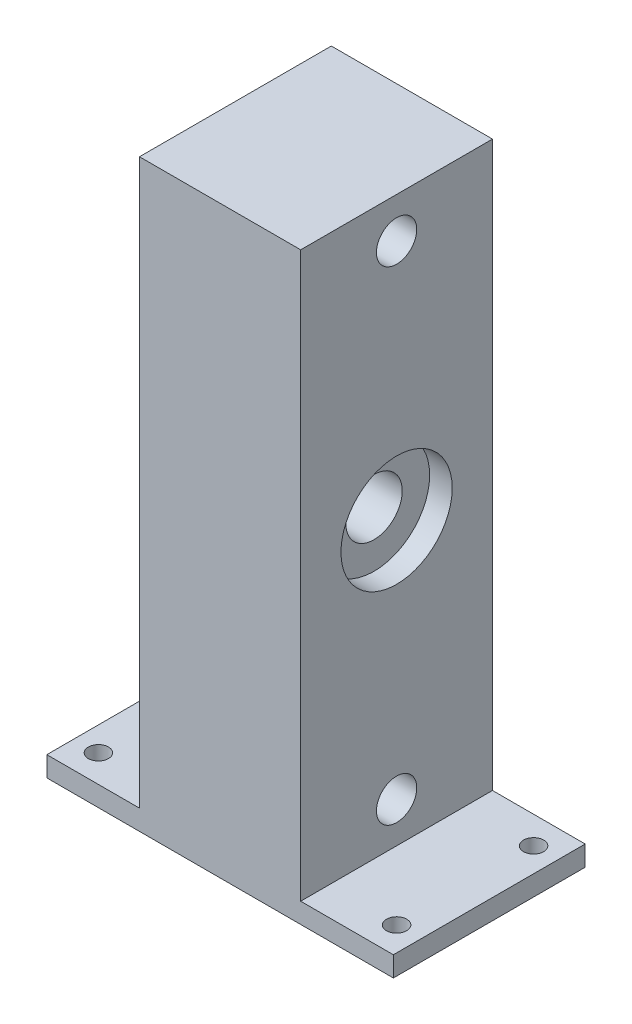
ISO-10303-21;
HEADER;
FILE_DESCRIPTION(('STEP AP214'),'2;1');
FILE_NAME('part.step','',(''),(''),'','','');
FILE_SCHEMA(('AUTOMOTIVE_DESIGN { 1 0 10303 214 1 1 1 1 }'));
ENDSEC;
DATA;
#1=APPLICATION_CONTEXT('core data for automotive mechanical design processes');
#2=APPLICATION_PROTOCOL_DEFINITION('international standard','automotive_design',2000,#1);
#3=PRODUCT_CONTEXT('',#1,'mechanical');
#4=PRODUCT('Part','Part','',(#3));
#5=PRODUCT_RELATED_PRODUCT_CATEGORY('part','',(#4));
#6=PRODUCT_DEFINITION_FORMATION('','',#4);
#7=PRODUCT_DEFINITION_CONTEXT('part definition',#1,'design');
#8=PRODUCT_DEFINITION('design','',#6,#7);
#9=PRODUCT_DEFINITION_SHAPE('','',#8);
#10=(LENGTH_UNIT() NAMED_UNIT(*) SI_UNIT(.MILLI.,.METRE.));
#11=(NAMED_UNIT(*) PLANE_ANGLE_UNIT() SI_UNIT($,.RADIAN.));
#12=(NAMED_UNIT(*) SI_UNIT($,.STERADIAN.) SOLID_ANGLE_UNIT());
#13=UNCERTAINTY_MEASURE_WITH_UNIT(LENGTH_MEASURE(1.E-05),#10,'distance_accuracy_value','');
#14=(GEOMETRIC_REPRESENTATION_CONTEXT(3) GLOBAL_UNCERTAINTY_ASSIGNED_CONTEXT((#13)) GLOBAL_UNIT_ASSIGNED_CONTEXT((#10,
#11,#12)) REPRESENTATION_CONTEXT('',''));
#15=CARTESIAN_POINT('',(0.,0.,0.));
#16=DIRECTION('',(0.,0.,1.));
#17=DIRECTION('',(1.,0.,0.));
#18=AXIS2_PLACEMENT_3D('',#15,#16,#17);
#19=CARTESIAN_POINT('',(-12.7,44.45,30.226));
#20=DIRECTION('',(1.,0.,0.));
#21=DIRECTION('',(0.,0.,-1.));
#22=AXIS2_PLACEMENT_3D('',#19,#20,#21);
#23=PLANE('',#22);
#24=DIRECTION('',(0.,-1.,0.));
#25=VECTOR('',#24,1.);
#26=CARTESIAN_POINT('',(-12.7,44.45,0.));
#27=LINE('',#26,#25);
#28=CARTESIAN_POINT('',(-12.7,44.45,0.));
#29=VERTEX_POINT('',#28);
#30=CARTESIAN_POINT('',(-12.7,-44.45,0.));
#31=VERTEX_POINT('',#30);
#32=EDGE_CURVE('E161',#29,#31,#27,.T.);
#33=ORIENTED_EDGE('',*,*,#32,.T.);
#34=DIRECTION('',(0.,0.,-1.));
#35=VECTOR('',#34,1.);
#36=CARTESIAN_POINT('',(-12.7,-44.45,30.226));
#37=LINE('',#36,#35);
#38=CARTESIAN_POINT('',(-12.7,-44.45,30.226));
#39=VERTEX_POINT('',#38);
#40=EDGE_CURVE('E11',#39,#31,#37,.T.);
#41=ORIENTED_EDGE('',*,*,#40,.F.);
#42=DIRECTION('',(0.,-1.,0.));
#43=VECTOR('',#42,1.);
#44=CARTESIAN_POINT('',(-12.7,44.45,30.226));
#45=LINE('',#44,#43);
#46=CARTESIAN_POINT('',(-12.7,44.45,30.226));
#47=VERTEX_POINT('',#46);
#48=EDGE_CURVE('E81',#47,#39,#45,.T.);
#49=ORIENTED_EDGE('',*,*,#48,.F.);
#50=DIRECTION('',(0.,0.,-1.));
#51=VECTOR('',#50,1.);
#52=CARTESIAN_POINT('',(-12.7,44.45,30.226));
#53=LINE('',#52,#51);
#54=EDGE_CURVE('E180',#47,#29,#53,.T.);
#55=ORIENTED_EDGE('',*,*,#54,.T.);
#56=EDGE_LOOP('',(#33,#41,#49,#55));
#57=FACE_BOUND('',#56,.T.);
#58=ADVANCED_FACE('F38',(#57),#23,.F.);
#59=CARTESIAN_POINT('',(12.7,44.45,30.226));
#60=DIRECTION('',(-1.,0.,0.));
#61=DIRECTION('',(0.,0.,1.));
#62=AXIS2_PLACEMENT_3D('',#59,#60,#61);
#63=PLANE('',#62);
#64=CARTESIAN_POINT('',(12.7,0.,15.113));
#65=DIRECTION('',(1.,0.,0.));
#66=DIRECTION('',(0.,0.,-1.));
#67=AXIS2_PLACEMENT_3D('',#64,#65,#66);
#68=CIRCLE('',#67,8.763);
#69=CARTESIAN_POINT('',(12.7,0.,6.35));
#70=VERTEX_POINT('',#69);
#71=EDGE_CURVE('E147',#70,#70,#68,.T.);
#72=ORIENTED_EDGE('',*,*,#71,.F.);
#73=EDGE_LOOP('',(#72));
#74=FACE_BOUND('',#73,.T.);
#75=CARTESIAN_POINT('',(12.7,38.1,15.113));
#76=DIRECTION('',(1.,0.,0.));
#77=DIRECTION('',(0.,0.,-1.));
#78=AXIS2_PLACEMENT_3D('',#75,#76,#77);
#79=CIRCLE('',#78,3.175);
#80=CARTESIAN_POINT('',(12.7,38.1,11.938));
#81=VERTEX_POINT('',#80);
#82=EDGE_CURVE('E162',#81,#81,#79,.T.);
#83=ORIENTED_EDGE('',*,*,#82,.F.);
#84=EDGE_LOOP('',(#83));
#85=FACE_BOUND('',#84,.T.);
#86=CARTESIAN_POINT('',(12.7,-38.1,15.113));
#87=DIRECTION('',(1.,0.,0.));
#88=DIRECTION('',(0.,0.,-1.));
#89=AXIS2_PLACEMENT_3D('',#86,#87,#88);
#90=CIRCLE('',#89,3.175);
#91=CARTESIAN_POINT('',(12.7,-38.1,11.938));
#92=VERTEX_POINT('',#91);
#93=EDGE_CURVE('E156',#92,#92,#90,.T.);
#94=ORIENTED_EDGE('',*,*,#93,.F.);
#95=EDGE_LOOP('',(#94));
#96=FACE_BOUND('',#95,.T.);
#97=DIRECTION('',(0.,1.,0.));
#98=VECTOR('',#97,1.);
#99=CARTESIAN_POINT('',(12.7,44.45,0.));
#100=LINE('',#99,#98);
#101=CARTESIAN_POINT('',(12.7,-44.45,0.));
#102=VERTEX_POINT('',#101);
#103=CARTESIAN_POINT('',(12.7,44.45,0.));
#104=VERTEX_POINT('',#103);
#105=EDGE_CURVE('E70',#102,#104,#100,.T.);
#106=ORIENTED_EDGE('',*,*,#105,.T.);
#107=DIRECTION('',(0.,0.,-1.));
#108=VECTOR('',#107,1.);
#109=CARTESIAN_POINT('',(12.7,44.45,30.226));
#110=LINE('',#109,#108);
#111=CARTESIAN_POINT('',(12.7,44.45,30.226));
#112=VERTEX_POINT('',#111);
#113=EDGE_CURVE('E189',#112,#104,#110,.T.);
#114=ORIENTED_EDGE('',*,*,#113,.F.);
#115=DIRECTION('',(0.,1.,0.));
#116=VECTOR('',#115,1.);
#117=CARTESIAN_POINT('',(12.7,44.45,30.226));
#118=LINE('',#117,#116);
#119=CARTESIAN_POINT('',(12.7,-44.45,30.226));
#120=VERTEX_POINT('',#119);
#121=EDGE_CURVE('E175',#120,#112,#118,.T.);
#122=ORIENTED_EDGE('',*,*,#121,.F.);
#123=DIRECTION('',(0.,0.,-1.));
#124=VECTOR('',#123,1.);
#125=CARTESIAN_POINT('',(12.7,-44.45,30.226));
#126=LINE('',#125,#124);
#127=EDGE_CURVE('E48',#120,#102,#126,.T.);
#128=ORIENTED_EDGE('',*,*,#127,.T.);
#129=EDGE_LOOP('',(#106,#114,#122,#128));
#130=FACE_BOUND('',#129,.T.);
#131=ADVANCED_FACE('F194',(#74,#85,#96,#130),#63,.F.);
#132=CARTESIAN_POINT('',(-12.7,44.45,30.226));
#133=DIRECTION('',(0.,-1.,0.));
#134=DIRECTION('',(0.,0.,-1.));
#135=AXIS2_PLACEMENT_3D('',#132,#133,#134);
#136=PLANE('',#135);
#137=DIRECTION('',(-1.,0.,0.));
#138=VECTOR('',#137,1.);
#139=CARTESIAN_POINT('',(-12.7,44.45,0.));
#140=LINE('',#139,#138);
#141=EDGE_CURVE('E76',#104,#29,#140,.T.);
#142=ORIENTED_EDGE('',*,*,#141,.T.);
#143=ORIENTED_EDGE('',*,*,#54,.F.);
#144=DIRECTION('',(-1.,0.,0.));
#145=VECTOR('',#144,1.);
#146=CARTESIAN_POINT('',(-12.7,44.45,30.226));
#147=LINE('',#146,#145);
#148=EDGE_CURVE('E56',#112,#47,#147,.T.);
#149=ORIENTED_EDGE('',*,*,#148,.F.);
#150=ORIENTED_EDGE('',*,*,#113,.T.);
#151=EDGE_LOOP('',(#142,#143,#149,#150));
#152=FACE_BOUND('',#151,.T.);
#153=ADVANCED_FACE('F290',(#152),#136,.F.);
#154=CARTESIAN_POINT('',(0.,0.,30.226));
#155=DIRECTION('',(0.,0.,1.));
#156=DIRECTION('',(1.,0.,0.));
#157=AXIS2_PLACEMENT_3D('',#154,#155,#156);
#158=PLANE('',#157);
#159=ORIENTED_EDGE('',*,*,#48,.T.);
#160=DIRECTION('',(-1.,0.,0.));
#161=VECTOR('',#160,1.);
#162=CARTESIAN_POINT('',(-27.305,-44.45,30.226));
#163=LINE('',#162,#161);
#164=CARTESIAN_POINT('',(-27.305,-44.45,30.226));
#165=VERTEX_POINT('',#164);
#166=EDGE_CURVE('E214',#39,#165,#163,.T.);
#167=ORIENTED_EDGE('',*,*,#166,.T.);
#168=DIRECTION('',(0.,1.,0.));
#169=VECTOR('',#168,1.);
#170=CARTESIAN_POINT('',(-27.305,-47.625,30.226));
#171=LINE('',#170,#169);
#172=CARTESIAN_POINT('',(-27.305,-47.625,30.226));
#173=VERTEX_POINT('',#172);
#174=EDGE_CURVE('E217',#173,#165,#171,.T.);
#175=ORIENTED_EDGE('',*,*,#174,.F.);
#176=DIRECTION('',(-1.,0.,0.));
#177=VECTOR('',#176,1.);
#178=CARTESIAN_POINT('',(-27.305,-47.625,30.226));
#179=LINE('',#178,#177);
#180=CARTESIAN_POINT('',(27.305,-47.625,30.226));
#181=VERTEX_POINT('',#180);
#182=EDGE_CURVE('E131',#181,#173,#179,.T.);
#183=ORIENTED_EDGE('',*,*,#182,.F.);
#184=DIRECTION('',(0.,1.,0.));
#185=VECTOR('',#184,1.);
#186=CARTESIAN_POINT('',(27.305,-47.625,30.226));
#187=LINE('',#186,#185);
#188=CARTESIAN_POINT('',(27.305,-44.45,30.226));
#189=VERTEX_POINT('',#188);
#190=EDGE_CURVE('E149',#181,#189,#187,.T.);
#191=ORIENTED_EDGE('',*,*,#190,.T.);
#192=EDGE_CURVE('E136',#189,#120,#163,.T.);
#193=ORIENTED_EDGE('',*,*,#192,.T.);
#194=ORIENTED_EDGE('',*,*,#121,.T.);
#195=ORIENTED_EDGE('',*,*,#148,.T.);
#196=EDGE_LOOP('',(#159,#167,#175,#183,#191,#193,#194,#195));
#197=FACE_BOUND('',#196,.T.);
#198=ADVANCED_FACE('F222',(#197),#158,.T.);
#199=CARTESIAN_POINT('',(0.,0.,0.));
#200=DIRECTION('',(0.,0.,1.));
#201=DIRECTION('',(1.,0.,0.));
#202=AXIS2_PLACEMENT_3D('',#199,#200,#201);
#203=PLANE('',#202);
#204=ORIENTED_EDGE('',*,*,#32,.F.);
#205=ORIENTED_EDGE('',*,*,#141,.F.);
#206=ORIENTED_EDGE('',*,*,#105,.F.);
#207=DIRECTION('',(1.,0.,0.));
#208=VECTOR('',#207,1.);
#209=CARTESIAN_POINT('',(-27.305,-44.45,0.));
#210=LINE('',#209,#208);
#211=CARTESIAN_POINT('',(27.305,-44.45,0.));
#212=VERTEX_POINT('',#211);
#213=EDGE_CURVE('E199',#102,#212,#210,.T.);
#214=ORIENTED_EDGE('',*,*,#213,.T.);
#215=DIRECTION('',(0.,1.,0.));
#216=VECTOR('',#215,1.);
#217=CARTESIAN_POINT('',(27.305,-47.625,0.));
#218=LINE('',#217,#216);
#219=CARTESIAN_POINT('',(27.305,-47.625,0.));
#220=VERTEX_POINT('',#219);
#221=EDGE_CURVE('E121',#220,#212,#218,.T.);
#222=ORIENTED_EDGE('',*,*,#221,.F.);
#223=DIRECTION('',(1.,0.,0.));
#224=VECTOR('',#223,1.);
#225=CARTESIAN_POINT('',(-27.305,-47.625,0.));
#226=LINE('',#225,#224);
#227=CARTESIAN_POINT('',(-27.305,-47.625,0.));
#228=VERTEX_POINT('',#227);
#229=EDGE_CURVE('E112',#228,#220,#226,.T.);
#230=ORIENTED_EDGE('',*,*,#229,.F.);
#231=DIRECTION('',(0.,1.,0.));
#232=VECTOR('',#231,1.);
#233=CARTESIAN_POINT('',(-27.305,-47.625,0.));
#234=LINE('',#233,#232);
#235=CARTESIAN_POINT('',(-27.305,-44.45,0.));
#236=VERTEX_POINT('',#235);
#237=EDGE_CURVE('E118',#228,#236,#234,.T.);
#238=ORIENTED_EDGE('',*,*,#237,.T.);
#239=EDGE_CURVE('E204',#236,#31,#210,.T.);
#240=ORIENTED_EDGE('',*,*,#239,.T.);
#241=EDGE_LOOP('',(#204,#205,#206,#214,#222,#230,#238,#240));
#242=FACE_BOUND('',#241,.T.);
#243=ADVANCED_FACE('F115',(#242),#203,.F.);
#244=CARTESIAN_POINT('',(0.,-38.1,15.113));
#245=DIRECTION('',(1.,0.,0.));
#246=DIRECTION('',(0.,0.,-1.));
#247=AXIS2_PLACEMENT_3D('',#244,#245,#246);
#248=CYLINDRICAL_SURFACE('',#247,3.175);
#249=CARTESIAN_POINT('',(0.,-38.1,15.113));
#250=DIRECTION('',(1.,0.,0.));
#251=DIRECTION('',(0.,0.,-1.));
#252=AXIS2_PLACEMENT_3D('',#249,#250,#251);
#253=CIRCLE('',#252,3.175);
#254=CARTESIAN_POINT('',(0.,-38.1,11.938));
#255=VERTEX_POINT('',#254);
#256=EDGE_CURVE('E166',#255,#255,#253,.T.);
#257=ORIENTED_EDGE('',*,*,#256,.F.);
#258=EDGE_LOOP('',(#257));
#259=FACE_BOUND('',#258,.T.);
#260=ORIENTED_EDGE('',*,*,#93,.T.);
#261=EDGE_LOOP('',(#260));
#262=FACE_BOUND('',#261,.T.);
#263=ADVANCED_FACE('F390',(#259,#262),#248,.F.);
#264=CARTESIAN_POINT('',(0.,-38.1,15.113));
#265=DIRECTION('',(1.,0.,0.));
#266=DIRECTION('',(0.,0.,-1.));
#267=AXIS2_PLACEMENT_3D('',#264,#265,#266);
#268=PLANE('',#267);
#269=ORIENTED_EDGE('',*,*,#256,.T.);
#270=EDGE_LOOP('',(#269));
#271=FACE_BOUND('',#270,.T.);
#272=ADVANCED_FACE('F435',(#271),#268,.T.);
#273=CARTESIAN_POINT('',(0.,38.1,15.113));
#274=DIRECTION('',(1.,0.,0.));
#275=DIRECTION('',(0.,0.,-1.));
#276=AXIS2_PLACEMENT_3D('',#273,#274,#275);
#277=CYLINDRICAL_SURFACE('',#276,3.175);
#278=CARTESIAN_POINT('',(0.,38.1,15.113));
#279=DIRECTION('',(1.,0.,0.));
#280=DIRECTION('',(0.,0.,-1.));
#281=AXIS2_PLACEMENT_3D('',#278,#279,#280);
#282=CIRCLE('',#281,3.175);
#283=CARTESIAN_POINT('',(0.,38.1,11.938));
#284=VERTEX_POINT('',#283);
#285=EDGE_CURVE('E157',#284,#284,#282,.T.);
#286=ORIENTED_EDGE('',*,*,#285,.F.);
#287=EDGE_LOOP('',(#286));
#288=FACE_BOUND('',#287,.T.);
#289=ORIENTED_EDGE('',*,*,#82,.T.);
#290=EDGE_LOOP('',(#289));
#291=FACE_BOUND('',#290,.T.);
#292=ADVANCED_FACE('F425',(#288,#291),#277,.F.);
#293=CARTESIAN_POINT('',(0.,38.1,15.113));
#294=DIRECTION('',(1.,0.,0.));
#295=DIRECTION('',(0.,0.,-1.));
#296=AXIS2_PLACEMENT_3D('',#293,#294,#295);
#297=PLANE('',#296);
#298=ORIENTED_EDGE('',*,*,#285,.T.);
#299=EDGE_LOOP('',(#298));
#300=FACE_BOUND('',#299,.T.);
#301=ADVANCED_FACE('F305',(#300),#297,.T.);
#302=CARTESIAN_POINT('',(9.14400000000001,0.,15.113));
#303=DIRECTION('',(1.,0.,0.));
#304=DIRECTION('',(0.,0.,-1.));
#305=AXIS2_PLACEMENT_3D('',#302,#303,#304);
#306=CYLINDRICAL_SURFACE('',#305,8.763);
#307=CARTESIAN_POINT('',(9.14400000000001,0.,15.113));
#308=DIRECTION('',(1.,0.,0.));
#309=DIRECTION('',(0.,0.,-1.));
#310=AXIS2_PLACEMENT_3D('',#307,#308,#309);
#311=CIRCLE('',#310,8.763);
#312=CARTESIAN_POINT('',(9.14400000000001,0.,6.35));
#313=VERTEX_POINT('',#312);
#314=EDGE_CURVE('E142',#313,#313,#311,.T.);
#315=ORIENTED_EDGE('',*,*,#314,.F.);
#316=EDGE_LOOP('',(#315));
#317=FACE_BOUND('',#316,.T.);
#318=ORIENTED_EDGE('',*,*,#71,.T.);
#319=EDGE_LOOP('',(#318));
#320=FACE_BOUND('',#319,.T.);
#321=ADVANCED_FACE('F297',(#317,#320),#306,.F.);
#322=CARTESIAN_POINT('',(0.,-44.45,0.));
#323=DIRECTION('',(0.,-1.,0.));
#324=DIRECTION('',(0.,0.,-1.));
#325=AXIS2_PLACEMENT_3D('',#322,#323,#324);
#326=PLANE('',#325);
#327=CARTESIAN_POINT('',(-23.495,-44.45,4.31799999999999));
#328=DIRECTION('',(0.,-1.,0.));
#329=DIRECTION('',(0.,0.,-1.));
#330=AXIS2_PLACEMENT_3D('',#327,#328,#329);
#331=CIRCLE('',#330,1.5875);
#332=CARTESIAN_POINT('',(-23.495,-44.45,2.73049999999999));
#333=VERTEX_POINT('',#332);
#334=EDGE_CURVE('E233',#333,#333,#331,.T.);
#335=ORIENTED_EDGE('',*,*,#334,.T.);
#336=EDGE_LOOP('',(#335));
#337=FACE_BOUND('',#336,.T.);
#338=CARTESIAN_POINT('',(-23.495,-44.45,25.908));
#339=DIRECTION('',(0.,-1.,0.));
#340=DIRECTION('',(0.,0.,-1.));
#341=AXIS2_PLACEMENT_3D('',#338,#339,#340);
#342=CIRCLE('',#341,1.5875);
#343=CARTESIAN_POINT('',(-23.495,-44.45,24.3205));
#344=VERTEX_POINT('',#343);
#345=EDGE_CURVE('E208',#344,#344,#342,.T.);
#346=ORIENTED_EDGE('',*,*,#345,.T.);
#347=EDGE_LOOP('',(#346));
#348=FACE_BOUND('',#347,.T.);
#349=ORIENTED_EDGE('',*,*,#166,.F.);
#350=ORIENTED_EDGE('',*,*,#40,.T.);
#351=ORIENTED_EDGE('',*,*,#239,.F.);
#352=DIRECTION('',(0.,0.,-1.));
#353=VECTOR('',#352,1.);
#354=CARTESIAN_POINT('',(-27.305,-44.45,30.226));
#355=LINE('',#354,#353);
#356=EDGE_CURVE('E140',#165,#236,#355,.T.);
#357=ORIENTED_EDGE('',*,*,#356,.F.);
#358=EDGE_LOOP('',(#349,#350,#351,#357));
#359=FACE_BOUND('',#358,.T.);
#360=ADVANCED_FACE('F294',(#337,#348,#359),#326,.F.);
#361=CARTESIAN_POINT('',(-27.305,-47.625,30.226));
#362=DIRECTION('',(1.,0.,0.));
#363=DIRECTION('',(0.,0.,-1.));
#364=AXIS2_PLACEMENT_3D('',#361,#362,#363);
#365=PLANE('',#364);
#366=ORIENTED_EDGE('',*,*,#356,.T.);
#367=ORIENTED_EDGE('',*,*,#237,.F.);
#368=DIRECTION('',(0.,0.,-1.));
#369=VECTOR('',#368,1.);
#370=CARTESIAN_POINT('',(-27.305,-47.625,30.226));
#371=LINE('',#370,#369);
#372=EDGE_CURVE('E126',#173,#228,#371,.T.);
#373=ORIENTED_EDGE('',*,*,#372,.F.);
#374=ORIENTED_EDGE('',*,*,#174,.T.);
#375=EDGE_LOOP('',(#366,#367,#373,#374));
#376=FACE_BOUND('',#375,.T.);
#377=ADVANCED_FACE('F138',(#376),#365,.F.);
#378=CARTESIAN_POINT('',(27.305,-47.625,30.226));
#379=DIRECTION('',(-1.,0.,0.));
#380=DIRECTION('',(0.,0.,1.));
#381=AXIS2_PLACEMENT_3D('',#378,#379,#380);
#382=PLANE('',#381);
#383=DIRECTION('',(0.,0.,1.));
#384=VECTOR('',#383,1.);
#385=CARTESIAN_POINT('',(27.305,-44.45,30.226));
#386=LINE('',#385,#384);
#387=EDGE_CURVE('E202',#212,#189,#386,.T.);
#388=ORIENTED_EDGE('',*,*,#387,.T.);
#389=ORIENTED_EDGE('',*,*,#190,.F.);
#390=DIRECTION('',(0.,0.,1.));
#391=VECTOR('',#390,1.);
#392=CARTESIAN_POINT('',(27.305,-47.625,30.226));
#393=LINE('',#392,#391);
#394=EDGE_CURVE('E125',#220,#181,#393,.T.);
#395=ORIENTED_EDGE('',*,*,#394,.F.);
#396=ORIENTED_EDGE('',*,*,#221,.T.);
#397=EDGE_LOOP('',(#388,#389,#395,#396));
#398=FACE_BOUND('',#397,.T.);
#399=ADVANCED_FACE('F224',(#398),#382,.F.);
#400=CARTESIAN_POINT('',(0.,-47.625,0.));
#401=DIRECTION('',(0.,-1.,0.));
#402=DIRECTION('',(0.,0.,-1.));
#403=AXIS2_PLACEMENT_3D('',#400,#401,#402);
#404=PLANE('',#403);
#405=CARTESIAN_POINT('',(23.495,-47.625,25.908));
#406=DIRECTION('',(0.,-1.,0.));
#407=DIRECTION('',(0.,0.,-1.));
#408=AXIS2_PLACEMENT_3D('',#405,#406,#407);
#409=CIRCLE('',#408,1.5875);
#410=CARTESIAN_POINT('',(23.495,-47.625,24.3205));
#411=VERTEX_POINT('',#410);
#412=EDGE_CURVE('E237',#411,#411,#409,.T.);
#413=ORIENTED_EDGE('',*,*,#412,.F.);
#414=EDGE_LOOP('',(#413));
#415=FACE_BOUND('',#414,.T.);
#416=CARTESIAN_POINT('',(23.495,-47.625,4.31799999999999));
#417=DIRECTION('',(0.,-1.,0.));
#418=DIRECTION('',(0.,0.,-1.));
#419=AXIS2_PLACEMENT_3D('',#416,#417,#418);
#420=CIRCLE('',#419,1.5875);
#421=CARTESIAN_POINT('',(23.495,-47.625,2.73049999999999));
#422=VERTEX_POINT('',#421);
#423=EDGE_CURVE('E245',#422,#422,#420,.T.);
#424=ORIENTED_EDGE('',*,*,#423,.F.);
#425=EDGE_LOOP('',(#424));
#426=FACE_BOUND('',#425,.T.);
#427=CARTESIAN_POINT('',(-23.495,-47.625,4.31799999999999));
#428=DIRECTION('',(0.,-1.,0.));
#429=DIRECTION('',(0.,0.,-1.));
#430=AXIS2_PLACEMENT_3D('',#427,#428,#429);
#431=CIRCLE('',#430,1.5875);
#432=CARTESIAN_POINT('',(-23.495,-47.625,2.73049999999999));
#433=VERTEX_POINT('',#432);
#434=EDGE_CURVE('E253',#433,#433,#431,.T.);
#435=ORIENTED_EDGE('',*,*,#434,.F.);
#436=EDGE_LOOP('',(#435));
#437=FACE_BOUND('',#436,.T.);
#438=CARTESIAN_POINT('',(-23.495,-47.625,25.908));
#439=DIRECTION('',(0.,-1.,0.));
#440=DIRECTION('',(0.,0.,-1.));
#441=AXIS2_PLACEMENT_3D('',#438,#439,#440);
#442=CIRCLE('',#441,1.5875);
#443=CARTESIAN_POINT('',(-23.495,-47.625,24.3205));
#444=VERTEX_POINT('',#443);
#445=EDGE_CURVE('E229',#444,#444,#442,.T.);
#446=ORIENTED_EDGE('',*,*,#445,.F.);
#447=EDGE_LOOP('',(#446));
#448=FACE_BOUND('',#447,.T.);
#449=ORIENTED_EDGE('',*,*,#372,.T.);
#450=ORIENTED_EDGE('',*,*,#229,.T.);
#451=ORIENTED_EDGE('',*,*,#394,.T.);
#452=ORIENTED_EDGE('',*,*,#182,.T.);
#453=EDGE_LOOP('',(#449,#450,#451,#452));
#454=FACE_BOUND('',#453,.T.);
#455=ADVANCED_FACE('F129',(#415,#426,#437,#448,#454),#404,.T.);
#456=CARTESIAN_POINT('',(23.495,-44.45,25.908));
#457=DIRECTION('',(0.,-1.,0.));
#458=DIRECTION('',(0.,0.,-1.));
#459=AXIS2_PLACEMENT_3D('',#456,#457,#458);
#460=CIRCLE('',#459,1.5875);
#461=CARTESIAN_POINT('',(23.495,-44.45,24.3205));
#462=VERTEX_POINT('',#461);
#463=EDGE_CURVE('E241',#462,#462,#460,.T.);
#464=ORIENTED_EDGE('',*,*,#463,.T.);
#465=EDGE_LOOP('',(#464));
#466=FACE_BOUND('',#465,.T.);
#467=CARTESIAN_POINT('',(23.495,-44.45,4.31799999999999));
#468=DIRECTION('',(0.,-1.,0.));
#469=DIRECTION('',(0.,0.,-1.));
#470=AXIS2_PLACEMENT_3D('',#467,#468,#469);
#471=CIRCLE('',#470,1.5875);
#472=CARTESIAN_POINT('',(23.495,-44.45,2.73049999999999));
#473=VERTEX_POINT('',#472);
#474=EDGE_CURVE('E249',#473,#473,#471,.T.);
#475=ORIENTED_EDGE('',*,*,#474,.T.);
#476=EDGE_LOOP('',(#475));
#477=FACE_BOUND('',#476,.T.);
#478=ORIENTED_EDGE('',*,*,#127,.F.);
#479=ORIENTED_EDGE('',*,*,#192,.F.);
#480=ORIENTED_EDGE('',*,*,#387,.F.);
#481=ORIENTED_EDGE('',*,*,#213,.F.);
#482=EDGE_LOOP('',(#478,#479,#480,#481));
#483=FACE_BOUND('',#482,.T.);
#484=ADVANCED_FACE('F201',(#466,#477,#483),#326,.F.);
#485=CARTESIAN_POINT('',(23.495,-44.45,4.31799999999999));
#486=DIRECTION('',(0.,-1.,0.));
#487=DIRECTION('',(0.,0.,-1.));
#488=AXIS2_PLACEMENT_3D('',#485,#486,#487);
#489=CYLINDRICAL_SURFACE('',#488,1.5875);
#490=ORIENTED_EDGE('',*,*,#474,.F.);
#491=EDGE_LOOP('',(#490));
#492=FACE_BOUND('',#491,.T.);
#493=ORIENTED_EDGE('',*,*,#423,.T.);
#494=EDGE_LOOP('',(#493));
#495=FACE_BOUND('',#494,.T.);
#496=ADVANCED_FACE('F312',(#492,#495),#489,.F.);
#497=CARTESIAN_POINT('',(23.495,-44.45,25.908));
#498=DIRECTION('',(0.,-1.,0.));
#499=DIRECTION('',(0.,0.,-1.));
#500=AXIS2_PLACEMENT_3D('',#497,#498,#499);
#501=CYLINDRICAL_SURFACE('',#500,1.5875);
#502=ORIENTED_EDGE('',*,*,#463,.F.);
#503=EDGE_LOOP('',(#502));
#504=FACE_BOUND('',#503,.T.);
#505=ORIENTED_EDGE('',*,*,#412,.T.);
#506=EDGE_LOOP('',(#505));
#507=FACE_BOUND('',#506,.T.);
#508=ADVANCED_FACE('F318',(#504,#507),#501,.F.);
#509=CARTESIAN_POINT('',(-23.495,-44.45,25.908));
#510=DIRECTION('',(0.,-1.,0.));
#511=DIRECTION('',(0.,0.,-1.));
#512=AXIS2_PLACEMENT_3D('',#509,#510,#511);
#513=CYLINDRICAL_SURFACE('',#512,1.5875);
#514=ORIENTED_EDGE('',*,*,#345,.F.);
#515=EDGE_LOOP('',(#514));
#516=FACE_BOUND('',#515,.T.);
#517=ORIENTED_EDGE('',*,*,#445,.T.);
#518=EDGE_LOOP('',(#517));
#519=FACE_BOUND('',#518,.T.);
#520=ADVANCED_FACE('F333',(#516,#519),#513,.F.);
#521=CARTESIAN_POINT('',(-23.495,-44.45,4.31799999999999));
#522=DIRECTION('',(0.,-1.,0.));
#523=DIRECTION('',(0.,0.,-1.));
#524=AXIS2_PLACEMENT_3D('',#521,#522,#523);
#525=CYLINDRICAL_SURFACE('',#524,1.5875);
#526=ORIENTED_EDGE('',*,*,#334,.F.);
#527=EDGE_LOOP('',(#526));
#528=FACE_BOUND('',#527,.T.);
#529=ORIENTED_EDGE('',*,*,#434,.T.);
#530=EDGE_LOOP('',(#529));
#531=FACE_BOUND('',#530,.T.);
#532=ADVANCED_FACE('F283',(#528,#531),#525,.F.);
#533=CARTESIAN_POINT('',(9.14400000000001,0.,15.113));
#534=DIRECTION('',(-1.,0.,0.));
#535=DIRECTION('',(0.,0.,1.));
#536=AXIS2_PLACEMENT_3D('',#533,#534,#535);
#537=PLANE('',#536);
#538=CARTESIAN_POINT('',(9.14400000000001,0.,15.113));
#539=DIRECTION('',(-1.,0.,0.));
#540=DIRECTION('',(0.,0.,1.));
#541=AXIS2_PLACEMENT_3D('',#538,#539,#540);
#542=CIRCLE('',#541,4.445);
#543=CARTESIAN_POINT('',(9.14400000000001,0.,19.558));
#544=VERTEX_POINT('',#543);
#545=EDGE_CURVE('E41',#544,#544,#542,.T.);
#546=ORIENTED_EDGE('',*,*,#545,.T.);
#547=EDGE_LOOP('',(#546));
#548=FACE_BOUND('',#547,.T.);
#549=ORIENTED_EDGE('',*,*,#314,.T.);
#550=EDGE_LOOP('',(#549));
#551=FACE_BOUND('',#550,.T.);
#552=ADVANCED_FACE('F269',(#548,#551),#537,.F.);
#553=CARTESIAN_POINT('',(0.,0.,15.113));
#554=DIRECTION('',(1.,0.,0.));
#555=DIRECTION('',(0.,0.,-1.));
#556=AXIS2_PLACEMENT_3D('',#553,#554,#555);
#557=CYLINDRICAL_SURFACE('',#556,4.445);
#558=CARTESIAN_POINT('',(0.,0.,15.113));
#559=DIRECTION('',(1.,0.,0.));
#560=DIRECTION('',(0.,0.,-1.));
#561=AXIS2_PLACEMENT_3D('',#558,#559,#560);
#562=CIRCLE('',#561,4.445);
#563=CARTESIAN_POINT('',(0.,0.,10.668));
#564=VERTEX_POINT('',#563);
#565=EDGE_CURVE('E260',#564,#564,#562,.T.);
#566=ORIENTED_EDGE('',*,*,#565,.F.);
#567=EDGE_LOOP('',(#566));
#568=FACE_BOUND('',#567,.T.);
#569=ORIENTED_EDGE('',*,*,#545,.F.);
#570=EDGE_LOOP('',(#569));
#571=FACE_BOUND('',#570,.T.);
#572=ADVANCED_FACE('F272',(#568,#571),#557,.F.);
#573=CARTESIAN_POINT('',(0.,0.,15.113));
#574=DIRECTION('',(1.,0.,0.));
#575=DIRECTION('',(0.,0.,-1.));
#576=AXIS2_PLACEMENT_3D('',#573,#574,#575);
#577=PLANE('',#576);
#578=ORIENTED_EDGE('',*,*,#565,.T.);
#579=EDGE_LOOP('',(#578));
#580=FACE_BOUND('',#579,.T.);
#581=ADVANCED_FACE('F274',(#580),#577,.T.);
#582=CLOSED_SHELL('',(#58,#131,#153,#198,#243,#263,#272,#292,#301,#321,#360,#377,#399,#455,#484,
#496,#508,#520,#532,#552,#572,#581));
#583=MANIFOLD_SOLID_BREP('B2',#582);
#584=ADVANCED_BREP_SHAPE_REPRESENTATION('',(#18,#583),#14);
#585=SHAPE_DEFINITION_REPRESENTATION(#9,#584);
ENDSEC;
END-ISO-10303-21;
